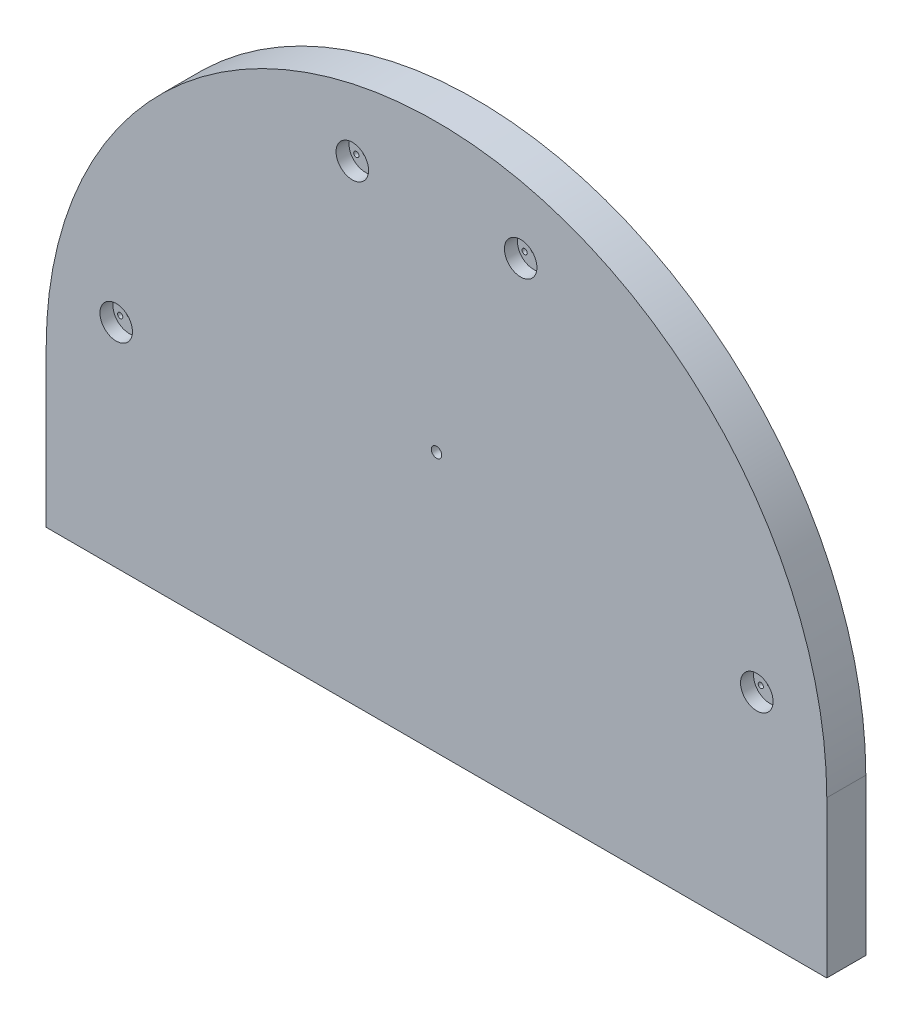
ISO-10303-21;
HEADER;
FILE_DESCRIPTION(('STEP AP214'),'2;1');
FILE_NAME('part.step','',(''),(''),'','','');
FILE_SCHEMA(('AUTOMOTIVE_DESIGN { 1 0 10303 214 1 1 1 1 }'));
ENDSEC;
DATA;
#1=APPLICATION_CONTEXT('core data for automotive mechanical design processes');
#2=APPLICATION_PROTOCOL_DEFINITION('international standard','automotive_design',2000,#1);
#3=PRODUCT_CONTEXT('',#1,'mechanical');
#4=PRODUCT('Part','Part','',(#3));
#5=PRODUCT_RELATED_PRODUCT_CATEGORY('part','',(#4));
#6=PRODUCT_DEFINITION_FORMATION('','',#4);
#7=PRODUCT_DEFINITION_CONTEXT('part definition',#1,'design');
#8=PRODUCT_DEFINITION('design','',#6,#7);
#9=PRODUCT_DEFINITION_SHAPE('','',#8);
#10=(LENGTH_UNIT() NAMED_UNIT(*) SI_UNIT(.MILLI.,.METRE.));
#11=(NAMED_UNIT(*) PLANE_ANGLE_UNIT() SI_UNIT($,.RADIAN.));
#12=(NAMED_UNIT(*) SI_UNIT($,.STERADIAN.) SOLID_ANGLE_UNIT());
#13=UNCERTAINTY_MEASURE_WITH_UNIT(LENGTH_MEASURE(1.E-05),#10,'distance_accuracy_value','');
#14=(GEOMETRIC_REPRESENTATION_CONTEXT(3) GLOBAL_UNCERTAINTY_ASSIGNED_CONTEXT((#13)) GLOBAL_UNIT_ASSIGNED_CONTEXT((#10,
#11,#12)) REPRESENTATION_CONTEXT('',''));
#15=CARTESIAN_POINT('',(0.,0.,0.));
#16=DIRECTION('',(0.,0.,1.));
#17=DIRECTION('',(1.,0.,0.));
#18=AXIS2_PLACEMENT_3D('',#15,#16,#17);
#19=CARTESIAN_POINT('',(246.201938253052,43.4120444167327,20.));
#20=DIRECTION('',(0.,0.,-1.));
#21=DIRECTION('',(-1.,0.,0.));
#22=AXIS2_PLACEMENT_3D('',#19,#20,#21);
#23=PLANE('',#22);
#24=CARTESIAN_POINT('',(239.273735022777,39.4120444167326,20.));
#25=DIRECTION('',(0.,0.,1.));
#26=DIRECTION('',(-1.,0.,0.));
#27=AXIS2_PLACEMENT_3D('',#24,#25,#26);
#28=CIRCLE('',#27,2.);
#29=CARTESIAN_POINT('',(237.273735022777,39.4120444167326,20.));
#30=VERTEX_POINT('',#29);
#31=EDGE_CURVE('E205',#30,#30,#28,.T.);
#32=ORIENTED_EDGE('',*,*,#31,.F.);
#33=EDGE_LOOP('',(#32));
#34=FACE_BOUND('',#33,.T.);
#35=CARTESIAN_POINT('',(246.201938253052,51.4120444167327,20.));
#36=DIRECTION('',(0.,0.,1.));
#37=DIRECTION('',(-1.,0.,0.));
#38=AXIS2_PLACEMENT_3D('',#35,#36,#37);
#39=CIRCLE('',#38,2.);
#40=CARTESIAN_POINT('',(244.201938253052,51.4120444167327,20.));
#41=VERTEX_POINT('',#40);
#42=EDGE_CURVE('E192',#41,#41,#39,.T.);
#43=ORIENTED_EDGE('',*,*,#42,.F.);
#44=EDGE_LOOP('',(#43));
#45=FACE_BOUND('',#44,.T.);
#46=CARTESIAN_POINT('',(253.130141483328,39.4120444167327,20.));
#47=DIRECTION('',(0.,0.,1.));
#48=DIRECTION('',(-1.,0.,0.));
#49=AXIS2_PLACEMENT_3D('',#46,#47,#48);
#50=CIRCLE('',#49,2.);
#51=CARTESIAN_POINT('',(251.130141483328,39.4120444167327,20.));
#52=VERTEX_POINT('',#51);
#53=EDGE_CURVE('E199',#52,#52,#50,.T.);
#54=ORIENTED_EDGE('',*,*,#53,.F.);
#55=EDGE_LOOP('',(#54));
#56=FACE_BOUND('',#55,.T.);
#57=CARTESIAN_POINT('',(246.201938253052,43.4120444167327,20.));
#58=DIRECTION('',(0.,0.,1.));
#59=DIRECTION('',(-1.,0.,0.));
#60=AXIS2_PLACEMENT_3D('',#57,#58,#59);
#61=CIRCLE('',#60,12.5);
#62=CARTESIAN_POINT('',(233.701938253052,43.4120444167327,20.));
#63=VERTEX_POINT('',#62);
#64=EDGE_CURVE('E117',#63,#63,#61,.T.);
#65=ORIENTED_EDGE('',*,*,#64,.T.);
#66=EDGE_LOOP('',(#65));
#67=FACE_BOUND('',#66,.T.);
#68=CARTESIAN_POINT('',(246.201938253052,43.4120444167327,20.));
#69=DIRECTION('',(0.,0.,1.));
#70=DIRECTION('',(-1.,0.,0.));
#71=AXIS2_PLACEMENT_3D('',#68,#69,#70);
#72=CIRCLE('',#71,2.);
#73=CARTESIAN_POINT('',(244.201938253052,43.4120444167327,20.));
#74=VERTEX_POINT('',#73);
#75=EDGE_CURVE('E206',#74,#74,#72,.T.);
#76=ORIENTED_EDGE('',*,*,#75,.F.);
#77=EDGE_LOOP('',(#76));
#78=FACE_BOUND('',#77,.T.);
#79=ADVANCED_FACE('F36',(#34,#45,#56,#67,#78),#23,.F.);
#80=CARTESIAN_POINT('',(64.7047612756304,241.481456572267,20.));
#81=DIRECTION('',(0.,0.,-1.));
#82=DIRECTION('',(-1.,0.,0.));
#83=AXIS2_PLACEMENT_3D('',#80,#81,#82);
#84=PLANE('',#83);
#85=CARTESIAN_POINT('',(64.7047612756304,249.481456572267,20.));
#86=DIRECTION('',(0.,0.,1.));
#87=DIRECTION('',(-1.,0.,0.));
#88=AXIS2_PLACEMENT_3D('',#85,#86,#87);
#89=CIRCLE('',#88,2.);
#90=CARTESIAN_POINT('',(62.7047612756304,249.481456572267,20.));
#91=VERTEX_POINT('',#90);
#92=EDGE_CURVE('E229',#91,#91,#89,.T.);
#93=ORIENTED_EDGE('',*,*,#92,.F.);
#94=EDGE_LOOP('',(#93));
#95=FACE_BOUND('',#94,.T.);
#96=CARTESIAN_POINT('',(71.6329645059059,237.481456572267,20.));
#97=DIRECTION('',(0.,0.,1.));
#98=DIRECTION('',(-1.,0.,0.));
#99=AXIS2_PLACEMENT_3D('',#96,#97,#98);
#100=CIRCLE('',#99,1.99999999999999);
#101=CARTESIAN_POINT('',(69.6329645059059,237.481456572267,20.));
#102=VERTEX_POINT('',#101);
#103=EDGE_CURVE('E212',#102,#102,#100,.T.);
#104=ORIENTED_EDGE('',*,*,#103,.F.);
#105=EDGE_LOOP('',(#104));
#106=FACE_BOUND('',#105,.T.);
#107=CARTESIAN_POINT('',(57.7765580453549,237.481456572267,20.));
#108=DIRECTION('',(0.,0.,1.));
#109=DIRECTION('',(-1.,0.,0.));
#110=AXIS2_PLACEMENT_3D('',#107,#108,#109);
#111=CIRCLE('',#110,2.00000000000002);
#112=CARTESIAN_POINT('',(55.7765580453549,237.481456572267,20.));
#113=VERTEX_POINT('',#112);
#114=EDGE_CURVE('E219',#113,#113,#111,.T.);
#115=ORIENTED_EDGE('',*,*,#114,.F.);
#116=EDGE_LOOP('',(#115));
#117=FACE_BOUND('',#116,.T.);
#118=CARTESIAN_POINT('',(64.7047612756304,241.481456572267,20.));
#119=DIRECTION('',(0.,0.,1.));
#120=DIRECTION('',(-1.,0.,0.));
#121=AXIS2_PLACEMENT_3D('',#118,#119,#120);
#122=CIRCLE('',#121,12.5);
#123=CARTESIAN_POINT('',(52.2047612756304,241.481456572267,20.));
#124=VERTEX_POINT('',#123);
#125=EDGE_CURVE('E118',#124,#124,#122,.T.);
#126=ORIENTED_EDGE('',*,*,#125,.T.);
#127=EDGE_LOOP('',(#126));
#128=FACE_BOUND('',#127,.T.);
#129=CARTESIAN_POINT('',(64.7047612756304,241.481456572267,20.));
#130=DIRECTION('',(0.,0.,1.));
#131=DIRECTION('',(-1.,0.,0.));
#132=AXIS2_PLACEMENT_3D('',#129,#130,#131);
#133=CIRCLE('',#132,2.);
#134=CARTESIAN_POINT('',(62.7047612756304,241.481456572267,20.));
#135=VERTEX_POINT('',#134);
#136=EDGE_CURVE('E168',#135,#135,#133,.T.);
#137=ORIENTED_EDGE('',*,*,#136,.F.);
#138=EDGE_LOOP('',(#137));
#139=FACE_BOUND('',#138,.T.);
#140=ADVANCED_FACE('F329',(#95,#106,#117,#128,#139),#84,.F.);
#141=CARTESIAN_POINT('',(0.,0.,30.));
#142=DIRECTION('',(0.,0.,-1.));
#143=DIRECTION('',(-1.,0.,0.));
#144=AXIS2_PLACEMENT_3D('',#141,#142,#143);
#145=CYLINDRICAL_SURFACE('',#144,300.);
#146=CARTESIAN_POINT('',(0.,0.,0.));
#147=DIRECTION('',(0.,0.,1.));
#148=DIRECTION('',(1.,0.,0.));
#149=AXIS2_PLACEMENT_3D('',#146,#147,#148);
#150=CIRCLE('',#149,300.);
#151=CARTESIAN_POINT('',(300.,0.,0.));
#152=VERTEX_POINT('',#151);
#153=CARTESIAN_POINT('',(-300.,0.,0.));
#154=VERTEX_POINT('',#153);
#155=EDGE_CURVE('E100',#152,#154,#150,.T.);
#156=ORIENTED_EDGE('',*,*,#155,.T.);
#157=DIRECTION('',(0.,0.,-1.));
#158=VECTOR('',#157,1.);
#159=CARTESIAN_POINT('',(-300.,0.,30.));
#160=LINE('',#159,#158);
#161=CARTESIAN_POINT('',(-300.,0.,30.));
#162=VERTEX_POINT('',#161);
#163=EDGE_CURVE('E11',#162,#154,#160,.T.);
#164=ORIENTED_EDGE('',*,*,#163,.F.);
#165=CARTESIAN_POINT('',(0.,0.,30.));
#166=DIRECTION('',(0.,0.,1.));
#167=DIRECTION('',(1.,0.,0.));
#168=AXIS2_PLACEMENT_3D('',#165,#166,#167);
#169=CIRCLE('',#168,300.);
#170=CARTESIAN_POINT('',(300.,0.,30.));
#171=VERTEX_POINT('',#170);
#172=EDGE_CURVE('E88',#171,#162,#169,.T.);
#173=ORIENTED_EDGE('',*,*,#172,.F.);
#174=DIRECTION('',(0.,0.,-1.));
#175=VECTOR('',#174,1.);
#176=CARTESIAN_POINT('',(300.,0.,30.));
#177=LINE('',#176,#175);
#178=EDGE_CURVE('E96',#171,#152,#177,.T.);
#179=ORIENTED_EDGE('',*,*,#178,.T.);
#180=EDGE_LOOP('',(#156,#164,#173,#179));
#181=FACE_BOUND('',#180,.T.);
#182=ADVANCED_FACE('F38',(#181),#145,.T.);
#183=CARTESIAN_POINT('',(-300.,0.,30.));
#184=DIRECTION('',(1.,0.,0.));
#185=DIRECTION('',(0.,1.,0.));
#186=AXIS2_PLACEMENT_3D('',#183,#184,#185);
#187=PLANE('',#186);
#188=DIRECTION('',(0.,-1.,0.));
#189=VECTOR('',#188,1.);
#190=CARTESIAN_POINT('',(-300.,0.,0.));
#191=LINE('',#190,#189);
#192=CARTESIAN_POINT('',(-300.,-120.,0.));
#193=VERTEX_POINT('',#192);
#194=EDGE_CURVE('E92',#154,#193,#191,.T.);
#195=ORIENTED_EDGE('',*,*,#194,.T.);
#196=DIRECTION('',(0.,0.,-1.));
#197=VECTOR('',#196,1.);
#198=CARTESIAN_POINT('',(-300.,-120.,30.));
#199=LINE('',#198,#197);
#200=CARTESIAN_POINT('',(-300.,-120.,30.));
#201=VERTEX_POINT('',#200);
#202=EDGE_CURVE('E45',#201,#193,#199,.T.);
#203=ORIENTED_EDGE('',*,*,#202,.F.);
#204=DIRECTION('',(0.,-1.,0.));
#205=VECTOR('',#204,1.);
#206=CARTESIAN_POINT('',(-300.,0.,30.));
#207=LINE('',#206,#205);
#208=EDGE_CURVE('E83',#162,#201,#207,.T.);
#209=ORIENTED_EDGE('',*,*,#208,.F.);
#210=ORIENTED_EDGE('',*,*,#163,.T.);
#211=EDGE_LOOP('',(#195,#203,#209,#210));
#212=FACE_BOUND('',#211,.T.);
#213=ADVANCED_FACE('F91',(#212),#187,.F.);
#214=CARTESIAN_POINT('',(-300.,-120.,30.));
#215=DIRECTION('',(0.,1.,0.));
#216=DIRECTION('',(0.,0.,1.));
#217=AXIS2_PLACEMENT_3D('',#214,#215,#216);
#218=PLANE('',#217);
#219=DIRECTION('',(1.,0.,0.));
#220=VECTOR('',#219,1.);
#221=CARTESIAN_POINT('',(-300.,-120.,0.));
#222=LINE('',#221,#220);
#223=CARTESIAN_POINT('',(300.,-120.,0.));
#224=VERTEX_POINT('',#223);
#225=EDGE_CURVE('E70',#193,#224,#222,.T.);
#226=ORIENTED_EDGE('',*,*,#225,.T.);
#227=DIRECTION('',(0.,0.,-1.));
#228=VECTOR('',#227,1.);
#229=CARTESIAN_POINT('',(300.,-120.,30.));
#230=LINE('',#229,#228);
#231=CARTESIAN_POINT('',(300.,-120.,30.));
#232=VERTEX_POINT('',#231);
#233=EDGE_CURVE('E93',#232,#224,#230,.T.);
#234=ORIENTED_EDGE('',*,*,#233,.F.);
#235=DIRECTION('',(1.,0.,0.));
#236=VECTOR('',#235,1.);
#237=CARTESIAN_POINT('',(-300.,-120.,30.));
#238=LINE('',#237,#236);
#239=EDGE_CURVE('E86',#201,#232,#238,.T.);
#240=ORIENTED_EDGE('',*,*,#239,.F.);
#241=ORIENTED_EDGE('',*,*,#202,.T.);
#242=EDGE_LOOP('',(#226,#234,#240,#241));
#243=FACE_BOUND('',#242,.T.);
#244=ADVANCED_FACE('F94',(#243),#218,.F.);
#245=CARTESIAN_POINT('',(300.,-120.,30.));
#246=DIRECTION('',(-1.,0.,0.));
#247=DIRECTION('',(0.,-1.,0.));
#248=AXIS2_PLACEMENT_3D('',#245,#246,#247);
#249=PLANE('',#248);
#250=DIRECTION('',(0.,1.,0.));
#251=VECTOR('',#250,1.);
#252=CARTESIAN_POINT('',(300.,-120.,0.));
#253=LINE('',#252,#251);
#254=EDGE_CURVE('E76',#224,#152,#253,.T.);
#255=ORIENTED_EDGE('',*,*,#254,.T.);
#256=ORIENTED_EDGE('',*,*,#178,.F.);
#257=DIRECTION('',(0.,1.,0.));
#258=VECTOR('',#257,1.);
#259=CARTESIAN_POINT('',(300.,-120.,30.));
#260=LINE('',#259,#258);
#261=EDGE_CURVE('E53',#232,#171,#260,.T.);
#262=ORIENTED_EDGE('',*,*,#261,.F.);
#263=ORIENTED_EDGE('',*,*,#233,.T.);
#264=EDGE_LOOP('',(#255,#256,#262,#263));
#265=FACE_BOUND('',#264,.T.);
#266=ADVANCED_FACE('F108',(#265),#249,.F.);
#267=CARTESIAN_POINT('',(0.,0.,30.));
#268=DIRECTION('',(0.,0.,1.));
#269=DIRECTION('',(1.,0.,0.));
#270=AXIS2_PLACEMENT_3D('',#267,#268,#269);
#271=PLANE('',#270);
#272=CARTESIAN_POINT('',(0.,80.,30.));
#273=DIRECTION('',(0.,0.,1.));
#274=DIRECTION('',(1.,0.,0.));
#275=AXIS2_PLACEMENT_3D('',#272,#273,#274);
#276=CIRCLE('',#275,4.);
#277=CARTESIAN_POINT('',(4.,80.,30.));
#278=VERTEX_POINT('',#277);
#279=EDGE_CURVE('E209',#278,#278,#276,.T.);
#280=ORIENTED_EDGE('',*,*,#279,.F.);
#281=EDGE_LOOP('',(#280));
#282=FACE_BOUND('',#281,.T.);
#283=CARTESIAN_POINT('',(-246.201938253052,43.4120444167327,30.));
#284=DIRECTION('',(0.,0.,1.));
#285=DIRECTION('',(1.,0.,0.));
#286=AXIS2_PLACEMENT_3D('',#283,#284,#285);
#287=CIRCLE('',#286,12.5);
#288=CARTESIAN_POINT('',(-233.701938253052,43.4120444167327,30.));
#289=VERTEX_POINT('',#288);
#290=EDGE_CURVE('E127',#289,#289,#287,.T.);
#291=ORIENTED_EDGE('',*,*,#290,.F.);
#292=EDGE_LOOP('',(#291));
#293=FACE_BOUND('',#292,.T.);
#294=CARTESIAN_POINT('',(64.7047612756304,241.481456572267,30.));
#295=DIRECTION('',(0.,0.,1.));
#296=DIRECTION('',(-1.,0.,0.));
#297=AXIS2_PLACEMENT_3D('',#294,#295,#296);
#298=CIRCLE('',#297,12.5);
#299=CARTESIAN_POINT('',(52.2047612756304,241.481456572267,30.));
#300=VERTEX_POINT('',#299);
#301=EDGE_CURVE('E128',#300,#300,#298,.T.);
#302=ORIENTED_EDGE('',*,*,#301,.F.);
#303=EDGE_LOOP('',(#302));
#304=FACE_BOUND('',#303,.T.);
#305=CARTESIAN_POINT('',(246.201938253052,43.4120444167327,30.));
#306=DIRECTION('',(0.,0.,1.));
#307=DIRECTION('',(-1.,0.,0.));
#308=AXIS2_PLACEMENT_3D('',#305,#306,#307);
#309=CIRCLE('',#308,12.5);
#310=CARTESIAN_POINT('',(233.701938253052,43.4120444167327,30.));
#311=VERTEX_POINT('',#310);
#312=EDGE_CURVE('E114',#311,#311,#309,.T.);
#313=ORIENTED_EDGE('',*,*,#312,.F.);
#314=EDGE_LOOP('',(#313));
#315=FACE_BOUND('',#314,.T.);
#316=CARTESIAN_POINT('',(-64.7047612756304,241.481456572267,30.));
#317=DIRECTION('',(0.,0.,1.));
#318=DIRECTION('',(1.,0.,0.));
#319=AXIS2_PLACEMENT_3D('',#316,#317,#318);
#320=CIRCLE('',#319,12.5);
#321=CARTESIAN_POINT('',(-52.2047612756304,241.481456572267,30.));
#322=VERTEX_POINT('',#321);
#323=EDGE_CURVE('E121',#322,#322,#320,.T.);
#324=ORIENTED_EDGE('',*,*,#323,.F.);
#325=EDGE_LOOP('',(#324));
#326=FACE_BOUND('',#325,.T.);
#327=ORIENTED_EDGE('',*,*,#172,.T.);
#328=ORIENTED_EDGE('',*,*,#208,.T.);
#329=ORIENTED_EDGE('',*,*,#239,.T.);
#330=ORIENTED_EDGE('',*,*,#261,.T.);
#331=EDGE_LOOP('',(#327,#328,#329,#330));
#332=FACE_BOUND('',#331,.T.);
#333=ADVANCED_FACE('F84',(#282,#293,#304,#315,#326,#332),#271,.T.);
#334=CARTESIAN_POINT('',(0.,0.,0.));
#335=DIRECTION('',(0.,0.,1.));
#336=DIRECTION('',(1.,0.,0.));
#337=AXIS2_PLACEMENT_3D('',#334,#335,#336);
#338=PLANE('',#337);
#339=CARTESIAN_POINT('',(0.,80.,0.));
#340=DIRECTION('',(0.,0.,-1.));
#341=DIRECTION('',(-1.,0.,0.));
#342=AXIS2_PLACEMENT_3D('',#339,#340,#341);
#343=CIRCLE('',#342,4.);
#344=CARTESIAN_POINT('',(-4.,80.,0.));
#345=VERTEX_POINT('',#344);
#346=EDGE_CURVE('E236',#345,#345,#343,.T.);
#347=ORIENTED_EDGE('',*,*,#346,.F.);
#348=EDGE_LOOP('',(#347));
#349=FACE_BOUND('',#348,.T.);
#350=CARTESIAN_POINT('',(64.7047612756304,241.481456572267,0.));
#351=DIRECTION('',(0.,0.,1.));
#352=DIRECTION('',(-1.,0.,0.));
#353=AXIS2_PLACEMENT_3D('',#350,#351,#352);
#354=CIRCLE('',#353,2.);
#355=CARTESIAN_POINT('',(62.7047612756304,241.481456572267,0.));
#356=VERTEX_POINT('',#355);
#357=EDGE_CURVE('E171',#356,#356,#354,.T.);
#358=ORIENTED_EDGE('',*,*,#357,.T.);
#359=EDGE_LOOP('',(#358));
#360=FACE_BOUND('',#359,.T.);
#361=CARTESIAN_POINT('',(-57.7765580453549,237.481456572267,0.));
#362=DIRECTION('',(0.,0.,1.));
#363=DIRECTION('',(1.,0.,0.));
#364=AXIS2_PLACEMENT_3D('',#361,#362,#363);
#365=CIRCLE('',#364,2.00000000000002);
#366=CARTESIAN_POINT('',(-55.7765580453549,237.481456572267,0.));
#367=VERTEX_POINT('',#366);
#368=EDGE_CURVE('E178',#367,#367,#365,.T.);
#369=ORIENTED_EDGE('',*,*,#368,.T.);
#370=EDGE_LOOP('',(#369));
#371=FACE_BOUND('',#370,.T.);
#372=CARTESIAN_POINT('',(-71.6329645059059,237.481456572267,0.));
#373=DIRECTION('',(0.,0.,1.));
#374=DIRECTION('',(1.,0.,0.));
#375=AXIS2_PLACEMENT_3D('',#372,#373,#374);
#376=CIRCLE('',#375,1.99999999999999);
#377=CARTESIAN_POINT('',(-69.6329645059059,237.481456572267,0.));
#378=VERTEX_POINT('',#377);
#379=EDGE_CURVE('E184',#378,#378,#376,.T.);
#380=ORIENTED_EDGE('',*,*,#379,.T.);
#381=EDGE_LOOP('',(#380));
#382=FACE_BOUND('',#381,.T.);
#383=CARTESIAN_POINT('',(-64.7047612756304,249.481456572267,0.));
#384=DIRECTION('',(0.,0.,1.));
#385=DIRECTION('',(1.,0.,0.));
#386=AXIS2_PLACEMENT_3D('',#383,#384,#385);
#387=CIRCLE('',#386,2.);
#388=CARTESIAN_POINT('',(-62.7047612756304,249.481456572267,0.));
#389=VERTEX_POINT('',#388);
#390=EDGE_CURVE('E148',#389,#389,#387,.T.);
#391=ORIENTED_EDGE('',*,*,#390,.T.);
#392=EDGE_LOOP('',(#391));
#393=FACE_BOUND('',#392,.T.);
#394=CARTESIAN_POINT('',(-239.273735022777,39.4120444167326,0.));
#395=DIRECTION('',(0.,0.,1.));
#396=DIRECTION('',(1.,0.,0.));
#397=AXIS2_PLACEMENT_3D('',#394,#395,#396);
#398=CIRCLE('',#397,2.);
#399=CARTESIAN_POINT('',(-237.273735022777,39.4120444167326,0.));
#400=VERTEX_POINT('',#399);
#401=EDGE_CURVE('E147',#400,#400,#398,.T.);
#402=ORIENTED_EDGE('',*,*,#401,.T.);
#403=EDGE_LOOP('',(#402));
#404=FACE_BOUND('',#403,.T.);
#405=CARTESIAN_POINT('',(-253.130141483328,39.4120444167327,0.));
#406=DIRECTION('',(0.,0.,1.));
#407=DIRECTION('',(1.,0.,0.));
#408=AXIS2_PLACEMENT_3D('',#405,#406,#407);
#409=CIRCLE('',#408,2.);
#410=CARTESIAN_POINT('',(-251.130141483328,39.4120444167327,0.));
#411=VERTEX_POINT('',#410);
#412=EDGE_CURVE('E154',#411,#411,#409,.T.);
#413=ORIENTED_EDGE('',*,*,#412,.T.);
#414=EDGE_LOOP('',(#413));
#415=FACE_BOUND('',#414,.T.);
#416=CARTESIAN_POINT('',(-246.201938253052,51.4120444167327,0.));
#417=DIRECTION('',(0.,0.,1.));
#418=DIRECTION('',(1.,0.,0.));
#419=AXIS2_PLACEMENT_3D('',#416,#417,#418);
#420=CIRCLE('',#419,2.);
#421=CARTESIAN_POINT('',(-244.201938253052,51.4120444167327,0.));
#422=VERTEX_POINT('',#421);
#423=EDGE_CURVE('E160',#422,#422,#420,.T.);
#424=ORIENTED_EDGE('',*,*,#423,.T.);
#425=EDGE_LOOP('',(#424));
#426=FACE_BOUND('',#425,.T.);
#427=CARTESIAN_POINT('',(-64.7047612756304,241.481456572267,0.));
#428=DIRECTION('',(0.,0.,1.));
#429=DIRECTION('',(1.,0.,0.));
#430=AXIS2_PLACEMENT_3D('',#427,#428,#429);
#431=CIRCLE('',#430,2.);
#432=CARTESIAN_POINT('',(-62.7047612756304,241.481456572267,0.));
#433=VERTEX_POINT('',#432);
#434=EDGE_CURVE('E141',#433,#433,#431,.T.);
#435=ORIENTED_EDGE('',*,*,#434,.T.);
#436=EDGE_LOOP('',(#435));
#437=FACE_BOUND('',#436,.T.);
#438=CARTESIAN_POINT('',(239.273735022777,39.4120444167326,0.));
#439=DIRECTION('',(0.,0.,1.));
#440=DIRECTION('',(-1.,0.,0.));
#441=AXIS2_PLACEMENT_3D('',#438,#439,#440);
#442=CIRCLE('',#441,2.);
#443=CARTESIAN_POINT('',(237.273735022777,39.4120444167326,0.));
#444=VERTEX_POINT('',#443);
#445=EDGE_CURVE('E226',#444,#444,#442,.T.);
#446=ORIENTED_EDGE('',*,*,#445,.T.);
#447=EDGE_LOOP('',(#446));
#448=FACE_BOUND('',#447,.T.);
#449=CARTESIAN_POINT('',(64.7047612756304,249.481456572267,0.));
#450=DIRECTION('',(0.,0.,1.));
#451=DIRECTION('',(-1.,0.,0.));
#452=AXIS2_PLACEMENT_3D('',#449,#450,#451);
#453=CIRCLE('',#452,2.);
#454=CARTESIAN_POINT('',(62.7047612756304,249.481456572267,0.));
#455=VERTEX_POINT('',#454);
#456=EDGE_CURVE('E216',#455,#455,#453,.T.);
#457=ORIENTED_EDGE('',*,*,#456,.T.);
#458=EDGE_LOOP('',(#457));
#459=FACE_BOUND('',#458,.T.);
#460=CARTESIAN_POINT('',(71.6329645059059,237.481456572267,0.));
#461=DIRECTION('',(0.,0.,1.));
#462=DIRECTION('',(-1.,0.,0.));
#463=AXIS2_PLACEMENT_3D('',#460,#461,#462);
#464=CIRCLE('',#463,1.99999999999999);
#465=CARTESIAN_POINT('',(69.6329645059059,237.481456572267,0.));
#466=VERTEX_POINT('',#465);
#467=EDGE_CURVE('E215',#466,#466,#464,.T.);
#468=ORIENTED_EDGE('',*,*,#467,.T.);
#469=EDGE_LOOP('',(#468));
#470=FACE_BOUND('',#469,.T.);
#471=CARTESIAN_POINT('',(57.7765580453549,237.481456572267,0.));
#472=DIRECTION('',(0.,0.,1.));
#473=DIRECTION('',(-1.,0.,0.));
#474=AXIS2_PLACEMENT_3D('',#471,#472,#473);
#475=CIRCLE('',#474,2.00000000000002);
#476=CARTESIAN_POINT('',(55.7765580453549,237.481456572267,0.));
#477=VERTEX_POINT('',#476);
#478=EDGE_CURVE('E172',#477,#477,#475,.T.);
#479=ORIENTED_EDGE('',*,*,#478,.T.);
#480=EDGE_LOOP('',(#479));
#481=FACE_BOUND('',#480,.T.);
#482=CARTESIAN_POINT('',(246.201938253052,43.4120444167327,0.));
#483=DIRECTION('',(0.,0.,1.));
#484=DIRECTION('',(-1.,0.,0.));
#485=AXIS2_PLACEMENT_3D('',#482,#483,#484);
#486=CIRCLE('',#485,2.);
#487=CARTESIAN_POINT('',(244.201938253052,43.4120444167327,0.));
#488=VERTEX_POINT('',#487);
#489=EDGE_CURVE('E196',#488,#488,#486,.T.);
#490=ORIENTED_EDGE('',*,*,#489,.T.);
#491=EDGE_LOOP('',(#490));
#492=FACE_BOUND('',#491,.T.);
#493=CARTESIAN_POINT('',(246.201938253052,51.4120444167327,0.));
#494=DIRECTION('',(0.,0.,1.));
#495=DIRECTION('',(-1.,0.,0.));
#496=AXIS2_PLACEMENT_3D('',#493,#494,#495);
#497=CIRCLE('',#496,2.);
#498=CARTESIAN_POINT('',(244.201938253052,51.4120444167327,0.));
#499=VERTEX_POINT('',#498);
#500=EDGE_CURVE('E195',#499,#499,#497,.T.);
#501=ORIENTED_EDGE('',*,*,#500,.T.);
#502=EDGE_LOOP('',(#501));
#503=FACE_BOUND('',#502,.T.);
#504=CARTESIAN_POINT('',(253.130141483328,39.4120444167327,0.));
#505=DIRECTION('',(0.,0.,1.));
#506=DIRECTION('',(-1.,0.,0.));
#507=AXIS2_PLACEMENT_3D('',#504,#505,#506);
#508=CIRCLE('',#507,2.);
#509=CARTESIAN_POINT('',(251.130141483328,39.4120444167327,0.));
#510=VERTEX_POINT('',#509);
#511=EDGE_CURVE('E202',#510,#510,#508,.T.);
#512=ORIENTED_EDGE('',*,*,#511,.T.);
#513=EDGE_LOOP('',(#512));
#514=FACE_BOUND('',#513,.T.);
#515=CARTESIAN_POINT('',(-246.201938253052,43.4120444167327,0.));
#516=DIRECTION('',(0.,0.,1.));
#517=DIRECTION('',(1.,0.,0.));
#518=AXIS2_PLACEMENT_3D('',#515,#516,#517);
#519=CIRCLE('',#518,2.);
#520=CARTESIAN_POINT('',(-244.201938253052,43.4120444167327,0.));
#521=VERTEX_POINT('',#520);
#522=EDGE_CURVE('E131',#521,#521,#519,.T.);
#523=ORIENTED_EDGE('',*,*,#522,.T.);
#524=EDGE_LOOP('',(#523));
#525=FACE_BOUND('',#524,.T.);
#526=ORIENTED_EDGE('',*,*,#155,.F.);
#527=ORIENTED_EDGE('',*,*,#254,.F.);
#528=ORIENTED_EDGE('',*,*,#225,.F.);
#529=ORIENTED_EDGE('',*,*,#194,.F.);
#530=EDGE_LOOP('',(#526,#527,#528,#529));
#531=FACE_BOUND('',#530,.T.);
#532=ADVANCED_FACE('F111',(#349,#360,#371,#382,#393,#404,#415,#426,#437,#448,#459,#470,#481,
#492,#503,#514,#525,#531),#338,.F.);
#533=CARTESIAN_POINT('',(-64.7047612756304,241.481456572267,20.));
#534=DIRECTION('',(0.,0.,1.));
#535=DIRECTION('',(1.,0.,0.));
#536=AXIS2_PLACEMENT_3D('',#533,#534,#535);
#537=CYLINDRICAL_SURFACE('',#536,12.5);
#538=CARTESIAN_POINT('',(-64.7047612756304,241.481456572267,20.));
#539=DIRECTION('',(0.,0.,1.));
#540=DIRECTION('',(1.,0.,0.));
#541=AXIS2_PLACEMENT_3D('',#538,#539,#540);
#542=CIRCLE('',#541,12.5);
#543=CARTESIAN_POINT('',(-52.2047612756304,241.481456572267,20.));
#544=VERTEX_POINT('',#543);
#545=EDGE_CURVE('E124',#544,#544,#542,.T.);
#546=ORIENTED_EDGE('',*,*,#545,.F.);
#547=EDGE_LOOP('',(#546));
#548=FACE_BOUND('',#547,.T.);
#549=ORIENTED_EDGE('',*,*,#323,.T.);
#550=EDGE_LOOP('',(#549));
#551=FACE_BOUND('',#550,.T.);
#552=ADVANCED_FACE('F244',(#548,#551),#537,.F.);
#553=CARTESIAN_POINT('',(-64.7047612756304,241.481456572267,20.));
#554=DIRECTION('',(0.,0.,1.));
#555=DIRECTION('',(1.,0.,0.));
#556=AXIS2_PLACEMENT_3D('',#553,#554,#555);
#557=PLANE('',#556);
#558=CARTESIAN_POINT('',(-64.7047612756304,241.481456572267,20.));
#559=DIRECTION('',(0.,0.,1.));
#560=DIRECTION('',(1.,0.,0.));
#561=AXIS2_PLACEMENT_3D('',#558,#559,#560);
#562=CIRCLE('',#561,2.);
#563=CARTESIAN_POINT('',(-62.7047612756304,241.481456572267,20.));
#564=VERTEX_POINT('',#563);
#565=EDGE_CURVE('E163',#564,#564,#562,.T.);
#566=ORIENTED_EDGE('',*,*,#565,.F.);
#567=EDGE_LOOP('',(#566));
#568=FACE_BOUND('',#567,.T.);
#569=CARTESIAN_POINT('',(-57.7765580453549,237.481456572267,20.));
#570=DIRECTION('',(0.,0.,1.));
#571=DIRECTION('',(1.,0.,0.));
#572=AXIS2_PLACEMENT_3D('',#569,#570,#571);
#573=CIRCLE('',#572,2.00000000000002);
#574=CARTESIAN_POINT('',(-55.7765580453549,237.481456572267,20.));
#575=VERTEX_POINT('',#574);
#576=EDGE_CURVE('E175',#575,#575,#573,.T.);
#577=ORIENTED_EDGE('',*,*,#576,.F.);
#578=EDGE_LOOP('',(#577));
#579=FACE_BOUND('',#578,.T.);
#580=CARTESIAN_POINT('',(-71.6329645059059,237.481456572267,20.));
#581=DIRECTION('',(0.,0.,1.));
#582=DIRECTION('',(1.,0.,0.));
#583=AXIS2_PLACEMENT_3D('',#580,#581,#582);
#584=CIRCLE('',#583,1.99999999999999);
#585=CARTESIAN_POINT('',(-69.6329645059059,237.481456572267,20.));
#586=VERTEX_POINT('',#585);
#587=EDGE_CURVE('E181',#586,#586,#584,.T.);
#588=ORIENTED_EDGE('',*,*,#587,.F.);
#589=EDGE_LOOP('',(#588));
#590=FACE_BOUND('',#589,.T.);
#591=CARTESIAN_POINT('',(-64.7047612756304,249.481456572267,20.));
#592=DIRECTION('',(0.,0.,1.));
#593=DIRECTION('',(1.,0.,0.));
#594=AXIS2_PLACEMENT_3D('',#591,#592,#593);
#595=CIRCLE('',#594,2.);
#596=CARTESIAN_POINT('',(-62.7047612756304,249.481456572267,20.));
#597=VERTEX_POINT('',#596);
#598=EDGE_CURVE('E187',#597,#597,#595,.T.);
#599=ORIENTED_EDGE('',*,*,#598,.F.);
#600=EDGE_LOOP('',(#599));
#601=FACE_BOUND('',#600,.T.);
#602=ORIENTED_EDGE('',*,*,#545,.T.);
#603=EDGE_LOOP('',(#602));
#604=FACE_BOUND('',#603,.T.);
#605=ADVANCED_FACE('F317',(#568,#579,#590,#601,#604),#557,.T.);
#606=CARTESIAN_POINT('',(246.201938253052,43.4120444167327,20.));
#607=DIRECTION('',(0.,0.,1.));
#608=DIRECTION('',(1.,0.,0.));
#609=AXIS2_PLACEMENT_3D('',#606,#607,#608);
#610=CYLINDRICAL_SURFACE('',#609,12.5);
#611=ORIENTED_EDGE('',*,*,#64,.F.);
#612=EDGE_LOOP('',(#611));
#613=FACE_BOUND('',#612,.T.);
#614=ORIENTED_EDGE('',*,*,#312,.T.);
#615=EDGE_LOOP('',(#614));
#616=FACE_BOUND('',#615,.T.);
#617=ADVANCED_FACE('F323',(#613,#616),#610,.F.);
#618=CARTESIAN_POINT('',(64.7047612756304,241.481456572267,20.));
#619=DIRECTION('',(0.,0.,1.));
#620=DIRECTION('',(1.,0.,0.));
#621=AXIS2_PLACEMENT_3D('',#618,#619,#620);
#622=CYLINDRICAL_SURFACE('',#621,12.5);
#623=ORIENTED_EDGE('',*,*,#125,.F.);
#624=EDGE_LOOP('',(#623));
#625=FACE_BOUND('',#624,.T.);
#626=ORIENTED_EDGE('',*,*,#301,.T.);
#627=EDGE_LOOP('',(#626));
#628=FACE_BOUND('',#627,.T.);
#629=ADVANCED_FACE('F302',(#625,#628),#622,.F.);
#630=CARTESIAN_POINT('',(-246.201938253052,43.4120444167327,20.));
#631=DIRECTION('',(0.,0.,1.));
#632=DIRECTION('',(1.,0.,0.));
#633=AXIS2_PLACEMENT_3D('',#630,#631,#632);
#634=CYLINDRICAL_SURFACE('',#633,12.5);
#635=CARTESIAN_POINT('',(-246.201938253052,43.4120444167327,20.));
#636=DIRECTION('',(0.,0.,1.));
#637=DIRECTION('',(1.,0.,0.));
#638=AXIS2_PLACEMENT_3D('',#635,#636,#637);
#639=CIRCLE('',#638,12.5);
#640=CARTESIAN_POINT('',(-233.701938253052,43.4120444167327,20.));
#641=VERTEX_POINT('',#640);
#642=EDGE_CURVE('E103',#641,#641,#639,.T.);
#643=ORIENTED_EDGE('',*,*,#642,.F.);
#644=EDGE_LOOP('',(#643));
#645=FACE_BOUND('',#644,.T.);
#646=ORIENTED_EDGE('',*,*,#290,.T.);
#647=EDGE_LOOP('',(#646));
#648=FACE_BOUND('',#647,.T.);
#649=ADVANCED_FACE('F290',(#645,#648),#634,.F.);
#650=CARTESIAN_POINT('',(-246.201938253052,43.4120444167327,20.));
#651=DIRECTION('',(0.,0.,1.));
#652=DIRECTION('',(1.,0.,0.));
#653=AXIS2_PLACEMENT_3D('',#650,#651,#652);
#654=PLANE('',#653);
#655=CARTESIAN_POINT('',(-246.201938253052,43.4120444167327,20.));
#656=DIRECTION('',(0.,0.,1.));
#657=DIRECTION('',(1.,0.,0.));
#658=AXIS2_PLACEMENT_3D('',#655,#656,#657);
#659=CIRCLE('',#658,2.);
#660=CARTESIAN_POINT('',(-244.201938253052,43.4120444167327,20.));
#661=VERTEX_POINT('',#660);
#662=EDGE_CURVE('E138',#661,#661,#659,.T.);
#663=ORIENTED_EDGE('',*,*,#662,.F.);
#664=EDGE_LOOP('',(#663));
#665=FACE_BOUND('',#664,.T.);
#666=CARTESIAN_POINT('',(-239.273735022777,39.4120444167326,20.));
#667=DIRECTION('',(0.,0.,1.));
#668=DIRECTION('',(1.,0.,0.));
#669=AXIS2_PLACEMENT_3D('',#666,#667,#668);
#670=CIRCLE('',#669,2.);
#671=CARTESIAN_POINT('',(-237.273735022777,39.4120444167326,20.));
#672=VERTEX_POINT('',#671);
#673=EDGE_CURVE('E144',#672,#672,#670,.T.);
#674=ORIENTED_EDGE('',*,*,#673,.F.);
#675=EDGE_LOOP('',(#674));
#676=FACE_BOUND('',#675,.T.);
#677=CARTESIAN_POINT('',(-253.130141483328,39.4120444167327,20.));
#678=DIRECTION('',(0.,0.,1.));
#679=DIRECTION('',(1.,0.,0.));
#680=AXIS2_PLACEMENT_3D('',#677,#678,#679);
#681=CIRCLE('',#680,2.);
#682=CARTESIAN_POINT('',(-251.130141483328,39.4120444167327,20.));
#683=VERTEX_POINT('',#682);
#684=EDGE_CURVE('E151',#683,#683,#681,.T.);
#685=ORIENTED_EDGE('',*,*,#684,.F.);
#686=EDGE_LOOP('',(#685));
#687=FACE_BOUND('',#686,.T.);
#688=CARTESIAN_POINT('',(-246.201938253052,51.4120444167327,20.));
#689=DIRECTION('',(0.,0.,1.));
#690=DIRECTION('',(1.,0.,0.));
#691=AXIS2_PLACEMENT_3D('',#688,#689,#690);
#692=CIRCLE('',#691,2.);
#693=CARTESIAN_POINT('',(-244.201938253052,51.4120444167327,20.));
#694=VERTEX_POINT('',#693);
#695=EDGE_CURVE('E157',#694,#694,#692,.T.);
#696=ORIENTED_EDGE('',*,*,#695,.F.);
#697=EDGE_LOOP('',(#696));
#698=FACE_BOUND('',#697,.T.);
#699=ORIENTED_EDGE('',*,*,#642,.T.);
#700=EDGE_LOOP('',(#699));
#701=FACE_BOUND('',#700,.T.);
#702=ADVANCED_FACE('F286',(#665,#676,#687,#698,#701),#654,.T.);
#703=CARTESIAN_POINT('',(-246.201938253052,51.4120444167327,0.));
#704=DIRECTION('',(0.,0.,1.));
#705=DIRECTION('',(1.,0.,0.));
#706=AXIS2_PLACEMENT_3D('',#703,#704,#705);
#707=CYLINDRICAL_SURFACE('',#706,2.);
#708=ORIENTED_EDGE('',*,*,#423,.F.);
#709=EDGE_LOOP('',(#708));
#710=FACE_BOUND('',#709,.T.);
#711=ORIENTED_EDGE('',*,*,#695,.T.);
#712=EDGE_LOOP('',(#711));
#713=FACE_BOUND('',#712,.T.);
#714=ADVANCED_FACE('F289',(#710,#713),#707,.F.);
#715=CARTESIAN_POINT('',(-253.130141483328,39.4120444167327,0.));
#716=DIRECTION('',(0.,0.,1.));
#717=DIRECTION('',(1.,0.,0.));
#718=AXIS2_PLACEMENT_3D('',#715,#716,#717);
#719=CYLINDRICAL_SURFACE('',#718,2.);
#720=ORIENTED_EDGE('',*,*,#412,.F.);
#721=EDGE_LOOP('',(#720));
#722=FACE_BOUND('',#721,.T.);
#723=ORIENTED_EDGE('',*,*,#684,.T.);
#724=EDGE_LOOP('',(#723));
#725=FACE_BOUND('',#724,.T.);
#726=ADVANCED_FACE('F382',(#722,#725),#719,.F.);
#727=CARTESIAN_POINT('',(-239.273735022777,39.4120444167326,0.));
#728=DIRECTION('',(0.,0.,1.));
#729=DIRECTION('',(1.,0.,0.));
#730=AXIS2_PLACEMENT_3D('',#727,#728,#729);
#731=CYLINDRICAL_SURFACE('',#730,2.);
#732=ORIENTED_EDGE('',*,*,#401,.F.);
#733=EDGE_LOOP('',(#732));
#734=FACE_BOUND('',#733,.T.);
#735=ORIENTED_EDGE('',*,*,#673,.T.);
#736=EDGE_LOOP('',(#735));
#737=FACE_BOUND('',#736,.T.);
#738=ADVANCED_FACE('F392',(#734,#737),#731,.F.);
#739=CARTESIAN_POINT('',(57.7765580453549,237.481456572267,0.));
#740=DIRECTION('',(0.,0.,1.));
#741=DIRECTION('',(1.,0.,0.));
#742=AXIS2_PLACEMENT_3D('',#739,#740,#741);
#743=CYLINDRICAL_SURFACE('',#742,2.00000000000002);
#744=ORIENTED_EDGE('',*,*,#478,.F.);
#745=EDGE_LOOP('',(#744));
#746=FACE_BOUND('',#745,.T.);
#747=ORIENTED_EDGE('',*,*,#114,.T.);
#748=EDGE_LOOP('',(#747));
#749=FACE_BOUND('',#748,.T.);
#750=ADVANCED_FACE('F402',(#746,#749),#743,.F.);
#751=CARTESIAN_POINT('',(71.6329645059059,237.481456572267,0.));
#752=DIRECTION('',(0.,0.,1.));
#753=DIRECTION('',(1.,0.,0.));
#754=AXIS2_PLACEMENT_3D('',#751,#752,#753);
#755=CYLINDRICAL_SURFACE('',#754,1.99999999999999);
#756=ORIENTED_EDGE('',*,*,#467,.F.);
#757=EDGE_LOOP('',(#756));
#758=FACE_BOUND('',#757,.T.);
#759=ORIENTED_EDGE('',*,*,#103,.T.);
#760=EDGE_LOOP('',(#759));
#761=FACE_BOUND('',#760,.T.);
#762=ADVANCED_FACE('F412',(#758,#761),#755,.F.);
#763=CARTESIAN_POINT('',(64.7047612756304,249.481456572267,0.));
#764=DIRECTION('',(0.,0.,1.));
#765=DIRECTION('',(1.,0.,0.));
#766=AXIS2_PLACEMENT_3D('',#763,#764,#765);
#767=CYLINDRICAL_SURFACE('',#766,2.);
#768=ORIENTED_EDGE('',*,*,#456,.F.);
#769=EDGE_LOOP('',(#768));
#770=FACE_BOUND('',#769,.T.);
#771=ORIENTED_EDGE('',*,*,#92,.T.);
#772=EDGE_LOOP('',(#771));
#773=FACE_BOUND('',#772,.T.);
#774=ADVANCED_FACE('F422',(#770,#773),#767,.F.);
#775=CARTESIAN_POINT('',(253.130141483328,39.4120444167327,0.));
#776=DIRECTION('',(0.,0.,1.));
#777=DIRECTION('',(1.,0.,0.));
#778=AXIS2_PLACEMENT_3D('',#775,#776,#777);
#779=CYLINDRICAL_SURFACE('',#778,2.);
#780=ORIENTED_EDGE('',*,*,#511,.F.);
#781=EDGE_LOOP('',(#780));
#782=FACE_BOUND('',#781,.T.);
#783=ORIENTED_EDGE('',*,*,#53,.T.);
#784=EDGE_LOOP('',(#783));
#785=FACE_BOUND('',#784,.T.);
#786=ADVANCED_FACE('F432',(#782,#785),#779,.F.);
#787=CARTESIAN_POINT('',(246.201938253052,51.4120444167327,0.));
#788=DIRECTION('',(0.,0.,1.));
#789=DIRECTION('',(1.,0.,0.));
#790=AXIS2_PLACEMENT_3D('',#787,#788,#789);
#791=CYLINDRICAL_SURFACE('',#790,2.);
#792=ORIENTED_EDGE('',*,*,#500,.F.);
#793=EDGE_LOOP('',(#792));
#794=FACE_BOUND('',#793,.T.);
#795=ORIENTED_EDGE('',*,*,#42,.T.);
#796=EDGE_LOOP('',(#795));
#797=FACE_BOUND('',#796,.T.);
#798=ADVANCED_FACE('F442',(#794,#797),#791,.F.);
#799=CARTESIAN_POINT('',(239.273735022777,39.4120444167326,0.));
#800=DIRECTION('',(0.,0.,1.));
#801=DIRECTION('',(1.,0.,0.));
#802=AXIS2_PLACEMENT_3D('',#799,#800,#801);
#803=CYLINDRICAL_SURFACE('',#802,2.);
#804=ORIENTED_EDGE('',*,*,#445,.F.);
#805=EDGE_LOOP('',(#804));
#806=FACE_BOUND('',#805,.T.);
#807=ORIENTED_EDGE('',*,*,#31,.T.);
#808=EDGE_LOOP('',(#807));
#809=FACE_BOUND('',#808,.T.);
#810=ADVANCED_FACE('F452',(#806,#809),#803,.F.);
#811=CARTESIAN_POINT('',(-64.7047612756304,249.481456572267,0.));
#812=DIRECTION('',(0.,0.,1.));
#813=DIRECTION('',(1.,0.,0.));
#814=AXIS2_PLACEMENT_3D('',#811,#812,#813);
#815=CYLINDRICAL_SURFACE('',#814,2.);
#816=ORIENTED_EDGE('',*,*,#390,.F.);
#817=EDGE_LOOP('',(#816));
#818=FACE_BOUND('',#817,.T.);
#819=ORIENTED_EDGE('',*,*,#598,.T.);
#820=EDGE_LOOP('',(#819));
#821=FACE_BOUND('',#820,.T.);
#822=ADVANCED_FACE('F462',(#818,#821),#815,.F.);
#823=CARTESIAN_POINT('',(-71.6329645059059,237.481456572267,0.));
#824=DIRECTION('',(0.,0.,1.));
#825=DIRECTION('',(1.,0.,0.));
#826=AXIS2_PLACEMENT_3D('',#823,#824,#825);
#827=CYLINDRICAL_SURFACE('',#826,1.99999999999999);
#828=ORIENTED_EDGE('',*,*,#379,.F.);
#829=EDGE_LOOP('',(#828));
#830=FACE_BOUND('',#829,.T.);
#831=ORIENTED_EDGE('',*,*,#587,.T.);
#832=EDGE_LOOP('',(#831));
#833=FACE_BOUND('',#832,.T.);
#834=ADVANCED_FACE('F472',(#830,#833),#827,.F.);
#835=CARTESIAN_POINT('',(-57.7765580453549,237.481456572267,0.));
#836=DIRECTION('',(0.,0.,1.));
#837=DIRECTION('',(1.,0.,0.));
#838=AXIS2_PLACEMENT_3D('',#835,#836,#837);
#839=CYLINDRICAL_SURFACE('',#838,2.00000000000002);
#840=ORIENTED_EDGE('',*,*,#368,.F.);
#841=EDGE_LOOP('',(#840));
#842=FACE_BOUND('',#841,.T.);
#843=ORIENTED_EDGE('',*,*,#576,.T.);
#844=EDGE_LOOP('',(#843));
#845=FACE_BOUND('',#844,.T.);
#846=ADVANCED_FACE('F282',(#842,#845),#839,.F.);
#847=CARTESIAN_POINT('',(-246.201938253052,43.4120444167327,0.));
#848=DIRECTION('',(0.,0.,1.));
#849=DIRECTION('',(1.,0.,0.));
#850=AXIS2_PLACEMENT_3D('',#847,#848,#849);
#851=CYLINDRICAL_SURFACE('',#850,2.);
#852=ORIENTED_EDGE('',*,*,#522,.F.);
#853=EDGE_LOOP('',(#852));
#854=FACE_BOUND('',#853,.T.);
#855=ORIENTED_EDGE('',*,*,#662,.T.);
#856=EDGE_LOOP('',(#855));
#857=FACE_BOUND('',#856,.T.);
#858=ADVANCED_FACE('F278',(#854,#857),#851,.F.);
#859=CARTESIAN_POINT('',(246.201938253052,43.4120444167327,0.));
#860=DIRECTION('',(0.,0.,1.));
#861=DIRECTION('',(1.,0.,0.));
#862=AXIS2_PLACEMENT_3D('',#859,#860,#861);
#863=CYLINDRICAL_SURFACE('',#862,2.);
#864=ORIENTED_EDGE('',*,*,#489,.F.);
#865=EDGE_LOOP('',(#864));
#866=FACE_BOUND('',#865,.T.);
#867=ORIENTED_EDGE('',*,*,#75,.T.);
#868=EDGE_LOOP('',(#867));
#869=FACE_BOUND('',#868,.T.);
#870=ADVANCED_FACE('F281',(#866,#869),#863,.F.);
#871=CARTESIAN_POINT('',(-64.7047612756304,241.481456572267,0.));
#872=DIRECTION('',(0.,0.,1.));
#873=DIRECTION('',(1.,0.,0.));
#874=AXIS2_PLACEMENT_3D('',#871,#872,#873);
#875=CYLINDRICAL_SURFACE('',#874,2.);
#876=ORIENTED_EDGE('',*,*,#434,.F.);
#877=EDGE_LOOP('',(#876));
#878=FACE_BOUND('',#877,.T.);
#879=ORIENTED_EDGE('',*,*,#565,.T.);
#880=EDGE_LOOP('',(#879));
#881=FACE_BOUND('',#880,.T.);
#882=ADVANCED_FACE('F506',(#878,#881),#875,.F.);
#883=CARTESIAN_POINT('',(64.7047612756304,241.481456572267,0.));
#884=DIRECTION('',(0.,0.,1.));
#885=DIRECTION('',(1.,0.,0.));
#886=AXIS2_PLACEMENT_3D('',#883,#884,#885);
#887=CYLINDRICAL_SURFACE('',#886,2.);
#888=ORIENTED_EDGE('',*,*,#357,.F.);
#889=EDGE_LOOP('',(#888));
#890=FACE_BOUND('',#889,.T.);
#891=ORIENTED_EDGE('',*,*,#136,.T.);
#892=EDGE_LOOP('',(#891));
#893=FACE_BOUND('',#892,.T.);
#894=ADVANCED_FACE('F516',(#890,#893),#887,.F.);
#895=CARTESIAN_POINT('',(0.,80.,59.));
#896=DIRECTION('',(0.,0.,-1.));
#897=DIRECTION('',(-1.,0.,0.));
#898=AXIS2_PLACEMENT_3D('',#895,#896,#897);
#899=CYLINDRICAL_SURFACE('',#898,4.);
#900=ORIENTED_EDGE('',*,*,#279,.T.);
#901=EDGE_LOOP('',(#900));
#902=FACE_BOUND('',#901,.T.);
#903=ORIENTED_EDGE('',*,*,#346,.T.);
#904=EDGE_LOOP('',(#903));
#905=FACE_BOUND('',#904,.T.);
#906=ADVANCED_FACE('F240',(#902,#905),#899,.F.);
#907=CLOSED_SHELL('',(#79,#140,#182,#213,#244,#266,#333,#532,#552,#605,#617,#629,#649,#702,#714,
#726,#738,#750,#762,#774,#786,#798,#810,#822,#834,#846,#858,#870,#882,#894,#906));
#908=MANIFOLD_SOLID_BREP('B2',#907);
#909=ADVANCED_BREP_SHAPE_REPRESENTATION('',(#18,#908),#14);
#910=SHAPE_DEFINITION_REPRESENTATION(#9,#909);
ENDSEC;
END-ISO-10303-21;
